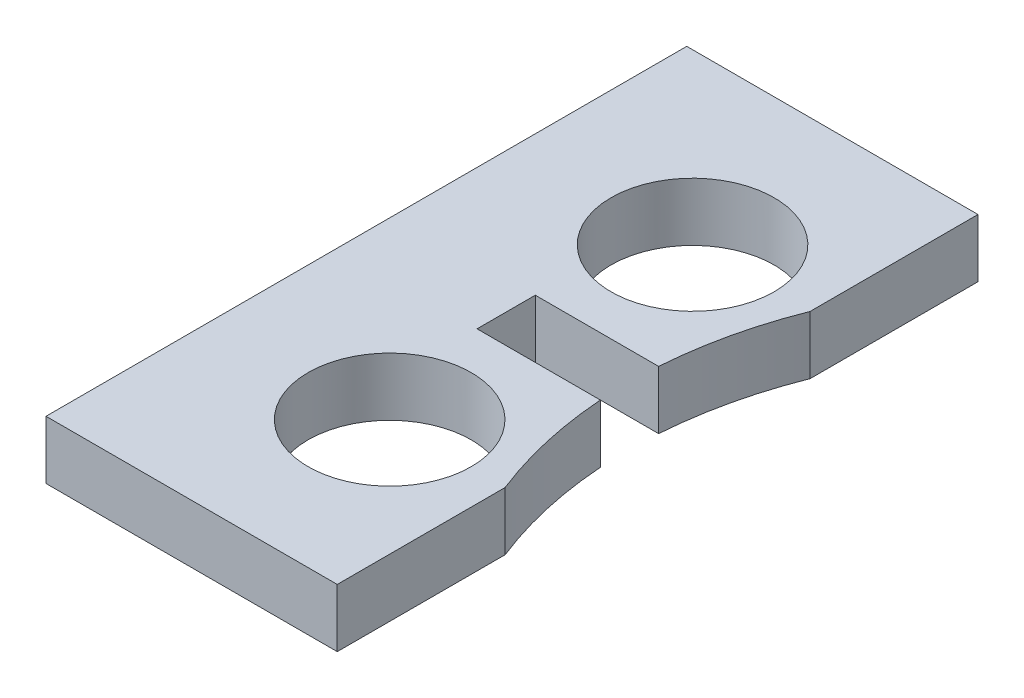
ISO-10303-21;
HEADER;
FILE_DESCRIPTION(('STEP AP214'),'2;1');
FILE_NAME('part.step','',(''),(''),'','','');
FILE_SCHEMA(('AUTOMOTIVE_DESIGN { 1 0 10303 214 1 1 1 1 }'));
ENDSEC;
DATA;
#1=APPLICATION_CONTEXT('core data for automotive mechanical design processes');
#2=APPLICATION_PROTOCOL_DEFINITION('international standard','automotive_design',2000,#1);
#3=PRODUCT_CONTEXT('',#1,'mechanical');
#4=PRODUCT('Part','Part','',(#3));
#5=PRODUCT_RELATED_PRODUCT_CATEGORY('part','',(#4));
#6=PRODUCT_DEFINITION_FORMATION('','',#4);
#7=PRODUCT_DEFINITION_CONTEXT('part definition',#1,'design');
#8=PRODUCT_DEFINITION('design','',#6,#7);
#9=PRODUCT_DEFINITION_SHAPE('','',#8);
#10=(LENGTH_UNIT() NAMED_UNIT(*) SI_UNIT(.MILLI.,.METRE.));
#11=(NAMED_UNIT(*) PLANE_ANGLE_UNIT() SI_UNIT($,.RADIAN.));
#12=(NAMED_UNIT(*) SI_UNIT($,.STERADIAN.) SOLID_ANGLE_UNIT());
#13=UNCERTAINTY_MEASURE_WITH_UNIT(LENGTH_MEASURE(1.E-05),#10,'distance_accuracy_value','');
#14=(GEOMETRIC_REPRESENTATION_CONTEXT(3) GLOBAL_UNCERTAINTY_ASSIGNED_CONTEXT((#13)) GLOBAL_UNIT_ASSIGNED_CONTEXT((#10,
#11,#12)) REPRESENTATION_CONTEXT('',''));
#15=CARTESIAN_POINT('',(0.,0.,0.));
#16=DIRECTION('',(0.,0.,1.));
#17=DIRECTION('',(1.,0.,0.));
#18=AXIS2_PLACEMENT_3D('',#15,#16,#17);
#19=CARTESIAN_POINT('',(0.,0.,0.));
#20=DIRECTION('',(0.,0.,1.));
#21=DIRECTION('',(1.,0.,0.));
#22=AXIS2_PLACEMENT_3D('',#19,#20,#21);
#23=PLANE('',#22);
#24=DIRECTION('',(0.,-1.,0.));
#25=VECTOR('',#24,1.);
#26=CARTESIAN_POINT('',(12.,5.,0.));
#27=LINE('',#26,#25);
#28=CARTESIAN_POINT('',(12.,5.,0.));
#29=VERTEX_POINT('',#28);
#30=CARTESIAN_POINT('',(12.,0.,0.));
#31=VERTEX_POINT('',#30);
#32=EDGE_CURVE('E54',#29,#31,#27,.T.);
#33=ORIENTED_EDGE('',*,*,#32,.F.);
#34=DIRECTION('',(1.,0.,0.));
#35=VECTOR('',#34,1.);
#36=CARTESIAN_POINT('',(0.,5.,0.));
#37=LINE('',#36,#35);
#38=CARTESIAN_POINT('',(22.5881375807484,5.,0.));
#39=VERTEX_POINT('',#38);
#40=EDGE_CURVE('E127',#29,#39,#37,.T.);
#41=ORIENTED_EDGE('',*,*,#40,.T.);
#42=DIRECTION('',(0.,-1.,0.));
#43=VECTOR('',#42,1.);
#44=CARTESIAN_POINT('',(22.5881375807484,10.,0.));
#45=LINE('',#44,#43);
#46=CARTESIAN_POINT('',(22.5881375807484,0.,0.));
#47=VERTEX_POINT('',#46);
#48=EDGE_CURVE('E11',#39,#47,#45,.T.);
#49=ORIENTED_EDGE('',*,*,#48,.T.);
#50=DIRECTION('',(1.,0.,0.));
#51=VECTOR('',#50,1.);
#52=CARTESIAN_POINT('',(0.,0.,0.));
#53=LINE('',#52,#51);
#54=EDGE_CURVE('E38',#31,#47,#53,.T.);
#55=ORIENTED_EDGE('',*,*,#54,.F.);
#56=EDGE_LOOP('',(#33,#41,#49,#55));
#57=FACE_BOUND('',#56,.T.);
#58=ADVANCED_FACE('F34',(#57),#23,.F.);
#59=CARTESIAN_POINT('',(0.,0.,-5.));
#60=DIRECTION('',(0.,0.,-1.));
#61=DIRECTION('',(-1.,0.,0.));
#62=AXIS2_PLACEMENT_3D('',#59,#60,#61);
#63=PLANE('',#62);
#64=DIRECTION('',(0.,1.,0.));
#65=VECTOR('',#64,1.);
#66=CARTESIAN_POINT('',(12.,5.,-5.));
#67=LINE('',#66,#65);
#68=CARTESIAN_POINT('',(12.,0.,-5.));
#69=VERTEX_POINT('',#68);
#70=CARTESIAN_POINT('',(12.,5.,-5.));
#71=VERTEX_POINT('',#70);
#72=EDGE_CURVE('E114',#69,#71,#67,.T.);
#73=ORIENTED_EDGE('',*,*,#72,.F.);
#74=DIRECTION('',(-1.,0.,0.));
#75=VECTOR('',#74,1.);
#76=CARTESIAN_POINT('',(0.,0.,-5.));
#77=LINE('',#76,#75);
#78=CARTESIAN_POINT('',(22.5881375807484,0.,-5.));
#79=VERTEX_POINT('',#78);
#80=EDGE_CURVE('E119',#79,#69,#77,.T.);
#81=ORIENTED_EDGE('',*,*,#80,.F.);
#82=DIRECTION('',(0.,-1.,0.));
#83=VECTOR('',#82,1.);
#84=CARTESIAN_POINT('',(22.5881375807484,10.,-5.));
#85=LINE('',#84,#83);
#86=CARTESIAN_POINT('',(22.5881375807484,5.,-5.));
#87=VERTEX_POINT('',#86);
#88=EDGE_CURVE('E44',#79,#87,#85,.F.);
#89=ORIENTED_EDGE('',*,*,#88,.T.);
#90=DIRECTION('',(1.,0.,0.));
#91=VECTOR('',#90,1.);
#92=CARTESIAN_POINT('',(0.,5.,-5.));
#93=LINE('',#92,#91);
#94=EDGE_CURVE('E109',#71,#87,#93,.T.);
#95=ORIENTED_EDGE('',*,*,#94,.F.);
#96=EDGE_LOOP('',(#73,#81,#89,#95));
#97=FACE_BOUND('',#96,.T.);
#98=ADVANCED_FACE('F111',(#97),#63,.F.);
#99=CARTESIAN_POINT('',(0.,0.,25.));
#100=DIRECTION('',(0.,1.,0.));
#101=DIRECTION('',(0.,0.,1.));
#102=AXIS2_PLACEMENT_3D('',#99,#100,#101);
#103=PLANE('',#102);
#104=DIRECTION('',(0.,0.,-1.));
#105=VECTOR('',#104,1.);
#106=CARTESIAN_POINT('',(12.,0.,-5.));
#107=LINE('',#106,#105);
#108=EDGE_CURVE('E133',#31,#69,#107,.T.);
#109=ORIENTED_EDGE('',*,*,#108,.F.);
#110=ORIENTED_EDGE('',*,*,#54,.T.);
#111=CARTESIAN_POINT('',(58.,0.,-2.5));
#112=DIRECTION('',(0.,-1.,0.));
#113=DIRECTION('',(0.,0.,-1.));
#114=AXIS2_PLACEMENT_3D('',#111,#112,#113);
#115=CIRCLE('',#114,35.5);
#116=CARTESIAN_POINT('',(25.,0.,10.5862523283024));
#117=VERTEX_POINT('',#116);
#118=EDGE_CURVE('E138',#117,#47,#115,.T.);
#119=ORIENTED_EDGE('',*,*,#118,.F.);
#120=DIRECTION('',(0.,0.,-1.));
#121=VECTOR('',#120,1.);
#122=CARTESIAN_POINT('',(25.,0.,25.));
#123=LINE('',#122,#121);
#124=CARTESIAN_POINT('',(25.,0.,25.));
#125=VERTEX_POINT('',#124);
#126=EDGE_CURVE('E183',#125,#117,#123,.T.);
#127=ORIENTED_EDGE('',*,*,#126,.F.);
#128=DIRECTION('',(1.,0.,0.));
#129=VECTOR('',#128,1.);
#130=CARTESIAN_POINT('',(0.,0.,25.));
#131=LINE('',#130,#129);
#132=CARTESIAN_POINT('',(0.,0.,25.));
#133=VERTEX_POINT('',#132);
#134=EDGE_CURVE('E180',#133,#125,#131,.T.);
#135=ORIENTED_EDGE('',*,*,#134,.F.);
#136=DIRECTION('',(0.,0.,-1.));
#137=VECTOR('',#136,1.);
#138=CARTESIAN_POINT('',(0.,0.,25.));
#139=LINE('',#138,#137);
#140=CARTESIAN_POINT('',(0.,0.,-30.));
#141=VERTEX_POINT('',#140);
#142=EDGE_CURVE('E202',#133,#141,#139,.T.);
#143=ORIENTED_EDGE('',*,*,#142,.T.);
#144=DIRECTION('',(-1.,0.,0.));
#145=VECTOR('',#144,1.);
#146=CARTESIAN_POINT('',(0.,0.,-30.));
#147=LINE('',#146,#145);
#148=CARTESIAN_POINT('',(25.,0.,-30.));
#149=VERTEX_POINT('',#148);
#150=EDGE_CURVE('E170',#149,#141,#147,.T.);
#151=ORIENTED_EDGE('',*,*,#150,.F.);
#152=DIRECTION('',(0.,0.,1.));
#153=VECTOR('',#152,1.);
#154=CARTESIAN_POINT('',(25.,0.,-30.));
#155=LINE('',#154,#153);
#156=CARTESIAN_POINT('',(25.,0.,-15.5862523283024));
#157=VERTEX_POINT('',#156);
#158=EDGE_CURVE('E173',#149,#157,#155,.T.);
#159=ORIENTED_EDGE('',*,*,#158,.T.);
#160=CARTESIAN_POINT('',(58.,0.,-2.5));
#161=DIRECTION('',(0.,-1.,0.));
#162=DIRECTION('',(0.,0.,-1.));
#163=AXIS2_PLACEMENT_3D('',#160,#161,#162);
#164=CIRCLE('',#163,35.5);
#165=EDGE_CURVE('E145',#79,#157,#164,.T.);
#166=ORIENTED_EDGE('',*,*,#165,.F.);
#167=ORIENTED_EDGE('',*,*,#80,.T.);
#168=EDGE_LOOP('',(#109,#110,#119,#127,#135,#143,#151,#159,#166,#167));
#169=FACE_BOUND('',#168,.T.);
#170=CARTESIAN_POINT('',(15.,0.,-15.5));
#171=DIRECTION('',(0.,1.,0.));
#172=DIRECTION('',(0.,0.,1.));
#173=AXIS2_PLACEMENT_3D('',#170,#171,#172);
#174=CIRCLE('',#173,7.);
#175=CARTESIAN_POINT('',(15.,0.,-8.5));
#176=VERTEX_POINT('',#175);
#177=EDGE_CURVE('E155',#176,#176,#174,.T.);
#178=ORIENTED_EDGE('',*,*,#177,.T.);
#179=EDGE_LOOP('',(#178));
#180=FACE_BOUND('',#179,.T.);
#181=CARTESIAN_POINT('',(15.,0.,10.5));
#182=DIRECTION('',(0.,1.,0.));
#183=DIRECTION('',(0.,0.,1.));
#184=AXIS2_PLACEMENT_3D('',#181,#182,#183);
#185=CIRCLE('',#184,7.);
#186=CARTESIAN_POINT('',(15.,0.,17.5));
#187=VERTEX_POINT('',#186);
#188=EDGE_CURVE('E120',#187,#187,#185,.T.);
#189=ORIENTED_EDGE('',*,*,#188,.T.);
#190=EDGE_LOOP('',(#189));
#191=FACE_BOUND('',#190,.T.);
#192=ADVANCED_FACE('F36',(#169,#180,#191),#103,.F.);
#193=CARTESIAN_POINT('',(25.,0.,25.));
#194=DIRECTION('',(-1.,0.,0.));
#195=DIRECTION('',(0.,0.,1.));
#196=AXIS2_PLACEMENT_3D('',#193,#194,#195);
#197=PLANE('',#196);
#198=ORIENTED_EDGE('',*,*,#126,.T.);
#199=DIRECTION('',(0.,-1.,0.));
#200=VECTOR('',#199,1.);
#201=CARTESIAN_POINT('',(25.,10.,10.5862523283024));
#202=LINE('',#201,#200);
#203=CARTESIAN_POINT('',(25.,5.,10.5862523283024));
#204=VERTEX_POINT('',#203);
#205=EDGE_CURVE('E141',#204,#117,#202,.T.);
#206=ORIENTED_EDGE('',*,*,#205,.F.);
#207=DIRECTION('',(0.,0.,-1.));
#208=VECTOR('',#207,1.);
#209=CARTESIAN_POINT('',(25.,5.,25.));
#210=LINE('',#209,#208);
#211=CARTESIAN_POINT('',(25.,5.,25.));
#212=VERTEX_POINT('',#211);
#213=EDGE_CURVE('E188',#212,#204,#210,.T.);
#214=ORIENTED_EDGE('',*,*,#213,.F.);
#215=DIRECTION('',(0.,1.,0.));
#216=VECTOR('',#215,1.);
#217=CARTESIAN_POINT('',(25.,0.,25.));
#218=LINE('',#217,#216);
#219=EDGE_CURVE('E197',#125,#212,#218,.T.);
#220=ORIENTED_EDGE('',*,*,#219,.F.);
#221=EDGE_LOOP('',(#198,#206,#214,#220));
#222=FACE_BOUND('',#221,.T.);
#223=ADVANCED_FACE('F234',(#222),#197,.F.);
#224=CARTESIAN_POINT('',(0.,5.,25.));
#225=DIRECTION('',(0.,1.,0.));
#226=DIRECTION('',(-1.,0.,0.));
#227=AXIS2_PLACEMENT_3D('',#224,#225,#226);
#228=PLANE('',#227);
#229=ORIENTED_EDGE('',*,*,#40,.F.);
#230=DIRECTION('',(0.,0.,1.));
#231=VECTOR('',#230,1.);
#232=CARTESIAN_POINT('',(12.,5.,-5.));
#233=LINE('',#232,#231);
#234=EDGE_CURVE('E123',#71,#29,#233,.T.);
#235=ORIENTED_EDGE('',*,*,#234,.F.);
#236=ORIENTED_EDGE('',*,*,#94,.T.);
#237=CARTESIAN_POINT('',(58.,5.,-2.5));
#238=DIRECTION('',(0.,1.,0.));
#239=DIRECTION('',(-1.,0.,0.));
#240=AXIS2_PLACEMENT_3D('',#237,#238,#239);
#241=CIRCLE('',#240,35.5);
#242=CARTESIAN_POINT('',(25.,5.,-15.5862523283024));
#243=VERTEX_POINT('',#242);
#244=EDGE_CURVE('E150',#243,#87,#241,.T.);
#245=ORIENTED_EDGE('',*,*,#244,.F.);
#246=DIRECTION('',(0.,0.,1.));
#247=VECTOR('',#246,1.);
#248=CARTESIAN_POINT('',(25.,5.,-30.));
#249=LINE('',#248,#247);
#250=CARTESIAN_POINT('',(25.,5.,-30.));
#251=VERTEX_POINT('',#250);
#252=EDGE_CURVE('E209',#251,#243,#249,.T.);
#253=ORIENTED_EDGE('',*,*,#252,.F.);
#254=DIRECTION('',(1.,0.,0.));
#255=VECTOR('',#254,1.);
#256=CARTESIAN_POINT('',(0.,5.,-30.));
#257=LINE('',#256,#255);
#258=CARTESIAN_POINT('',(0.,5.,-30.));
#259=VERTEX_POINT('',#258);
#260=EDGE_CURVE('E166',#259,#251,#257,.T.);
#261=ORIENTED_EDGE('',*,*,#260,.F.);
#262=DIRECTION('',(0.,0.,-1.));
#263=VECTOR('',#262,1.);
#264=CARTESIAN_POINT('',(0.,5.,25.));
#265=LINE('',#264,#263);
#266=CARTESIAN_POINT('',(0.,5.,25.));
#267=VERTEX_POINT('',#266);
#268=EDGE_CURVE('E204',#267,#259,#265,.T.);
#269=ORIENTED_EDGE('',*,*,#268,.F.);
#270=DIRECTION('',(1.,0.,0.));
#271=VECTOR('',#270,1.);
#272=CARTESIAN_POINT('',(0.,5.,25.));
#273=LINE('',#272,#271);
#274=EDGE_CURVE('E194',#267,#212,#273,.T.);
#275=ORIENTED_EDGE('',*,*,#274,.T.);
#276=ORIENTED_EDGE('',*,*,#213,.T.);
#277=CARTESIAN_POINT('',(58.,5.,-2.5));
#278=DIRECTION('',(0.,1.,0.));
#279=DIRECTION('',(-1.,0.,0.));
#280=AXIS2_PLACEMENT_3D('',#277,#278,#279);
#281=CIRCLE('',#280,35.5);
#282=EDGE_CURVE('E143',#39,#204,#281,.T.);
#283=ORIENTED_EDGE('',*,*,#282,.F.);
#284=EDGE_LOOP('',(#229,#235,#236,#245,#253,#261,#269,#275,#276,#283));
#285=FACE_BOUND('',#284,.T.);
#286=CARTESIAN_POINT('',(15.,5.,-15.5));
#287=DIRECTION('',(0.,1.,0.));
#288=DIRECTION('',(-1.,0.,0.));
#289=AXIS2_PLACEMENT_3D('',#286,#287,#288);
#290=CIRCLE('',#289,7.);
#291=CARTESIAN_POINT('',(8.,5.,-15.5));
#292=VERTEX_POINT('',#291);
#293=EDGE_CURVE('E152',#292,#292,#290,.T.);
#294=ORIENTED_EDGE('',*,*,#293,.F.);
#295=EDGE_LOOP('',(#294));
#296=FACE_BOUND('',#295,.T.);
#297=CARTESIAN_POINT('',(15.,5.,10.5));
#298=DIRECTION('',(0.,1.,0.));
#299=DIRECTION('',(-1.,0.,0.));
#300=AXIS2_PLACEMENT_3D('',#297,#298,#299);
#301=CIRCLE('',#300,7.);
#302=CARTESIAN_POINT('',(8.,5.,10.5));
#303=VERTEX_POINT('',#302);
#304=EDGE_CURVE('E158',#303,#303,#301,.T.);
#305=ORIENTED_EDGE('',*,*,#304,.F.);
#306=EDGE_LOOP('',(#305));
#307=FACE_BOUND('',#306,.T.);
#308=ADVANCED_FACE('F124',(#285,#296,#307),#228,.T.);
#309=CARTESIAN_POINT('',(0.,0.,25.));
#310=DIRECTION('',(0.,0.,1.));
#311=DIRECTION('',(1.,0.,0.));
#312=AXIS2_PLACEMENT_3D('',#309,#310,#311);
#313=PLANE('',#312);
#314=ORIENTED_EDGE('',*,*,#274,.F.);
#315=DIRECTION('',(0.,1.,0.));
#316=VECTOR('',#315,1.);
#317=CARTESIAN_POINT('',(0.,0.,25.));
#318=LINE('',#317,#316);
#319=EDGE_CURVE('E205',#133,#267,#318,.T.);
#320=ORIENTED_EDGE('',*,*,#319,.F.);
#321=ORIENTED_EDGE('',*,*,#134,.T.);
#322=ORIENTED_EDGE('',*,*,#219,.T.);
#323=EDGE_LOOP('',(#314,#320,#321,#322));
#324=FACE_BOUND('',#323,.T.);
#325=ADVANCED_FACE('F233',(#324),#313,.T.);
#326=CARTESIAN_POINT('',(0.,0.,25.));
#327=DIRECTION('',(-1.,0.,0.));
#328=DIRECTION('',(0.,0.,1.));
#329=AXIS2_PLACEMENT_3D('',#326,#327,#328);
#330=PLANE('',#329);
#331=ORIENTED_EDGE('',*,*,#268,.T.);
#332=DIRECTION('',(0.,1.,0.));
#333=VECTOR('',#332,1.);
#334=CARTESIAN_POINT('',(0.,0.,-30.));
#335=LINE('',#334,#333);
#336=EDGE_CURVE('E163',#141,#259,#335,.T.);
#337=ORIENTED_EDGE('',*,*,#336,.F.);
#338=ORIENTED_EDGE('',*,*,#142,.F.);
#339=ORIENTED_EDGE('',*,*,#319,.T.);
#340=EDGE_LOOP('',(#331,#337,#338,#339));
#341=FACE_BOUND('',#340,.T.);
#342=ADVANCED_FACE('F230',(#341),#330,.T.);
#343=CARTESIAN_POINT('',(25.,0.,-30.));
#344=DIRECTION('',(-1.,0.,0.));
#345=DIRECTION('',(0.,0.,1.));
#346=AXIS2_PLACEMENT_3D('',#343,#344,#345);
#347=PLANE('',#346);
#348=ORIENTED_EDGE('',*,*,#252,.T.);
#349=DIRECTION('',(0.,-1.,0.));
#350=VECTOR('',#349,1.);
#351=CARTESIAN_POINT('',(25.,10.,-15.5862523283024));
#352=LINE('',#351,#350);
#353=EDGE_CURVE('E147',#243,#157,#352,.T.);
#354=ORIENTED_EDGE('',*,*,#353,.T.);
#355=ORIENTED_EDGE('',*,*,#158,.F.);
#356=DIRECTION('',(0.,-1.,0.));
#357=VECTOR('',#356,1.);
#358=CARTESIAN_POINT('',(25.,0.,-30.));
#359=LINE('',#358,#357);
#360=EDGE_CURVE('E168',#251,#149,#359,.T.);
#361=ORIENTED_EDGE('',*,*,#360,.F.);
#362=EDGE_LOOP('',(#348,#354,#355,#361));
#363=FACE_BOUND('',#362,.T.);
#364=ADVANCED_FACE('F219',(#363),#347,.F.);
#365=CARTESIAN_POINT('',(0.,0.,-30.));
#366=DIRECTION('',(0.,0.,-1.));
#367=DIRECTION('',(-1.,0.,0.));
#368=AXIS2_PLACEMENT_3D('',#365,#366,#367);
#369=PLANE('',#368);
#370=ORIENTED_EDGE('',*,*,#336,.T.);
#371=ORIENTED_EDGE('',*,*,#260,.T.);
#372=ORIENTED_EDGE('',*,*,#360,.T.);
#373=ORIENTED_EDGE('',*,*,#150,.T.);
#374=EDGE_LOOP('',(#370,#371,#372,#373));
#375=FACE_BOUND('',#374,.T.);
#376=ADVANCED_FACE('F227',(#375),#369,.T.);
#377=CARTESIAN_POINT('',(15.,-25.,10.5));
#378=DIRECTION('',(0.,1.,0.));
#379=DIRECTION('',(-1.,0.,0.));
#380=AXIS2_PLACEMENT_3D('',#377,#378,#379);
#381=CYLINDRICAL_SURFACE('',#380,7.);
#382=ORIENTED_EDGE('',*,*,#304,.T.);
#383=EDGE_LOOP('',(#382));
#384=FACE_BOUND('',#383,.T.);
#385=ORIENTED_EDGE('',*,*,#188,.F.);
#386=EDGE_LOOP('',(#385));
#387=FACE_BOUND('',#386,.T.);
#388=ADVANCED_FACE('F309',(#384,#387),#381,.F.);
#389=CARTESIAN_POINT('',(15.,-25.,-15.5));
#390=DIRECTION('',(0.,1.,0.));
#391=DIRECTION('',(-1.,0.,0.));
#392=AXIS2_PLACEMENT_3D('',#389,#390,#391);
#393=CYLINDRICAL_SURFACE('',#392,7.);
#394=ORIENTED_EDGE('',*,*,#293,.T.);
#395=EDGE_LOOP('',(#394));
#396=FACE_BOUND('',#395,.T.);
#397=ORIENTED_EDGE('',*,*,#177,.F.);
#398=EDGE_LOOP('',(#397));
#399=FACE_BOUND('',#398,.T.);
#400=ADVANCED_FACE('F282',(#396,#399),#393,.F.);
#401=CARTESIAN_POINT('',(58.,10.,-2.5));
#402=DIRECTION('',(0.,-1.,0.));
#403=DIRECTION('',(0.,0.,-1.));
#404=AXIS2_PLACEMENT_3D('',#401,#402,#403);
#405=CYLINDRICAL_SURFACE('',#404,35.5);
#406=ORIENTED_EDGE('',*,*,#244,.T.);
#407=ORIENTED_EDGE('',*,*,#88,.F.);
#408=ORIENTED_EDGE('',*,*,#165,.T.);
#409=ORIENTED_EDGE('',*,*,#353,.F.);
#410=EDGE_LOOP('',(#406,#407,#408,#409));
#411=FACE_BOUND('',#410,.T.);
#412=ADVANCED_FACE('F222',(#411),#405,.F.);
#413=CARTESIAN_POINT('',(58.,10.,-2.5));
#414=DIRECTION('',(0.,-1.,0.));
#415=DIRECTION('',(0.,0.,-1.));
#416=AXIS2_PLACEMENT_3D('',#413,#414,#415);
#417=CYLINDRICAL_SURFACE('',#416,35.5);
#418=ORIENTED_EDGE('',*,*,#282,.T.);
#419=ORIENTED_EDGE('',*,*,#205,.T.);
#420=ORIENTED_EDGE('',*,*,#118,.T.);
#421=ORIENTED_EDGE('',*,*,#48,.F.);
#422=EDGE_LOOP('',(#418,#419,#420,#421));
#423=FACE_BOUND('',#422,.T.);
#424=ADVANCED_FACE('F237',(#423),#417,.F.);
#425=CARTESIAN_POINT('',(12.,0.,0.));
#426=DIRECTION('',(-1.,0.,0.));
#427=DIRECTION('',(0.,0.,1.));
#428=AXIS2_PLACEMENT_3D('',#425,#426,#427);
#429=PLANE('',#428);
#430=ORIENTED_EDGE('',*,*,#72,.T.);
#431=ORIENTED_EDGE('',*,*,#234,.T.);
#432=ORIENTED_EDGE('',*,*,#32,.T.);
#433=ORIENTED_EDGE('',*,*,#108,.T.);
#434=EDGE_LOOP('',(#430,#431,#432,#433));
#435=FACE_BOUND('',#434,.T.);
#436=ADVANCED_FACE('F131',(#435),#429,.F.);
#437=CLOSED_SHELL('',(#58,#98,#192,#223,#308,#325,#342,#364,#376,#388,#400,#412,#424,#436));
#438=MANIFOLD_SOLID_BREP('B2',#437);
#439=ADVANCED_BREP_SHAPE_REPRESENTATION('',(#18,#438),#14);
#440=SHAPE_DEFINITION_REPRESENTATION(#9,#439);
ENDSEC;
END-ISO-10303-21;
